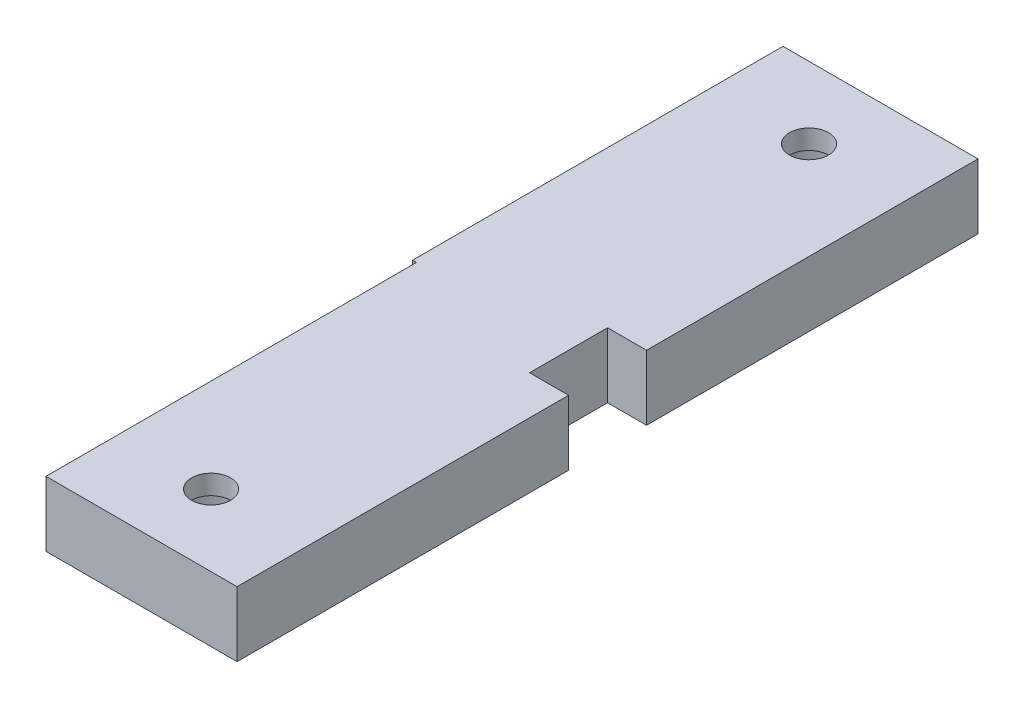
ISO-10303-21;
HEADER;
FILE_DESCRIPTION(('STEP AP214'),'2;1');
FILE_NAME('part.step','',(''),(''),'','','');
FILE_SCHEMA(('AUTOMOTIVE_DESIGN { 1 0 10303 214 1 1 1 1 }'));
ENDSEC;
DATA;
#1=APPLICATION_CONTEXT('core data for automotive mechanical design processes');
#2=APPLICATION_PROTOCOL_DEFINITION('international standard','automotive_design',2000,#1);
#3=PRODUCT_CONTEXT('',#1,'mechanical');
#4=PRODUCT('Part','Part','',(#3));
#5=PRODUCT_RELATED_PRODUCT_CATEGORY('part','',(#4));
#6=PRODUCT_DEFINITION_FORMATION('','',#4);
#7=PRODUCT_DEFINITION_CONTEXT('part definition',#1,'design');
#8=PRODUCT_DEFINITION('design','',#6,#7);
#9=PRODUCT_DEFINITION_SHAPE('','',#8);
#10=(LENGTH_UNIT() NAMED_UNIT(*) SI_UNIT(.MILLI.,.METRE.));
#11=(NAMED_UNIT(*) PLANE_ANGLE_UNIT() SI_UNIT($,.RADIAN.));
#12=(NAMED_UNIT(*) SI_UNIT($,.STERADIAN.) SOLID_ANGLE_UNIT());
#13=UNCERTAINTY_MEASURE_WITH_UNIT(LENGTH_MEASURE(1.E-05),#10,'distance_accuracy_value','');
#14=(GEOMETRIC_REPRESENTATION_CONTEXT(3) GLOBAL_UNCERTAINTY_ASSIGNED_CONTEXT((#13)) GLOBAL_UNIT_ASSIGNED_CONTEXT((#10,
#11,#12)) REPRESENTATION_CONTEXT('',''));
#15=CARTESIAN_POINT('',(0.,0.,0.));
#16=DIRECTION('',(0.,0.,1.));
#17=DIRECTION('',(1.,0.,0.));
#18=AXIS2_PLACEMENT_3D('',#15,#16,#17);
#19=CARTESIAN_POINT('',(-22.4306549314346,5.,42.4705817510549));
#20=DIRECTION('',(0.,0.,-1.));
#21=DIRECTION('',(-1.,0.,0.));
#22=AXIS2_PLACEMENT_3D('',#19,#20,#21);
#23=PLANE('',#22);
#24=DIRECTION('',(0.,-1.,0.));
#25=VECTOR('',#24,1.);
#26=CARTESIAN_POINT('',(-19.1306549314346,5.,42.4705817510549));
#27=LINE('',#26,#25);
#28=CARTESIAN_POINT('',(-19.1306549314346,5.,42.4705817510549));
#29=VERTEX_POINT('',#28);
#30=CARTESIAN_POINT('',(-19.1306549314346,0.,42.4705817510549));
#31=VERTEX_POINT('',#30);
#32=EDGE_CURVE('E122',#29,#31,#27,.T.);
#33=ORIENTED_EDGE('',*,*,#32,.T.);
#34=DIRECTION('',(1.,0.,0.));
#35=VECTOR('',#34,1.);
#36=CARTESIAN_POINT('',(-22.4306549314346,0.,42.4705817510549));
#37=LINE('',#36,#35);
#38=CARTESIAN_POINT('',(-4.4306549314346,0.,42.4705817510549));
#39=VERTEX_POINT('',#38);
#40=EDGE_CURVE('E238',#31,#39,#37,.T.);
#41=ORIENTED_EDGE('',*,*,#40,.T.);
#42=DIRECTION('',(0.,1.,0.));
#43=VECTOR('',#42,1.);
#44=CARTESIAN_POINT('',(-4.43065493143459,0.,42.4705817510548));
#45=LINE('',#44,#43);
#46=CARTESIAN_POINT('',(-4.43065493143459,5.,42.4705817510548));
#47=VERTEX_POINT('',#46);
#48=EDGE_CURVE('E200',#39,#47,#45,.T.);
#49=ORIENTED_EDGE('',*,*,#48,.T.);
#50=DIRECTION('',(1.,0.,0.));
#51=VECTOR('',#50,1.);
#52=CARTESIAN_POINT('',(-22.4306549314346,5.,42.4705817510549));
#53=LINE('',#52,#51);
#54=EDGE_CURVE('E11',#29,#47,#53,.T.);
#55=ORIENTED_EDGE('',*,*,#54,.F.);
#56=EDGE_LOOP('',(#33,#41,#49,#55));
#57=FACE_BOUND('',#56,.T.);
#58=ADVANCED_FACE('F38',(#57),#23,.F.);
#59=CARTESIAN_POINT('',(0.,5.,0.));
#60=DIRECTION('',(0.,-1.,0.));
#61=DIRECTION('',(0.,0.,-1.));
#62=AXIS2_PLACEMENT_3D('',#59,#60,#61);
#63=PLANE('',#62);
#64=CARTESIAN_POINT('',(-11.9306549314346,5.,36.9705817510549));
#65=DIRECTION('',(0.,1.,0.));
#66=DIRECTION('',(0.,0.,1.));
#67=AXIS2_PLACEMENT_3D('',#64,#65,#66);
#68=CIRCLE('',#67,1.5);
#69=CARTESIAN_POINT('',(-11.9306549314346,5.,38.4705817510549));
#70=VERTEX_POINT('',#69);
#71=EDGE_CURVE('E231',#70,#70,#68,.T.);
#72=ORIENTED_EDGE('',*,*,#71,.F.);
#73=EDGE_LOOP('',(#72));
#74=FACE_BOUND('',#73,.T.);
#75=CARTESIAN_POINT('',(-11.9306549314346,5.,-9.02941824894515));
#76=DIRECTION('',(0.,1.,0.));
#77=DIRECTION('',(0.,0.,1.));
#78=AXIS2_PLACEMENT_3D('',#75,#76,#77);
#79=CIRCLE('',#78,1.5);
#80=CARTESIAN_POINT('',(-11.9306549314346,5.,-7.52941824894515));
#81=VERTEX_POINT('',#80);
#82=EDGE_CURVE('E227',#81,#81,#79,.T.);
#83=ORIENTED_EDGE('',*,*,#82,.F.);
#84=EDGE_LOOP('',(#83));
#85=FACE_BOUND('',#84,.T.);
#86=DIRECTION('',(0.,0.,-1.));
#87=VECTOR('',#86,1.);
#88=CARTESIAN_POINT('',(-19.1306549314346,5.,0.));
#89=LINE('',#88,#87);
#90=CARTESIAN_POINT('',(-19.1306549314346,5.,13.9705817510549));
#91=VERTEX_POINT('',#90);
#92=EDGE_CURVE('E117',#29,#91,#89,.T.);
#93=ORIENTED_EDGE('',*,*,#92,.F.);
#94=ORIENTED_EDGE('',*,*,#54,.T.);
#95=DIRECTION('',(0.,0.,1.));
#96=VECTOR('',#95,1.);
#97=CARTESIAN_POINT('',(-4.43065493143459,5.,-14.5294182489452));
#98=LINE('',#97,#96);
#99=CARTESIAN_POINT('',(-4.43065493143459,5.,16.9705817510548));
#100=VERTEX_POINT('',#99);
#101=EDGE_CURVE('E175',#100,#47,#98,.T.);
#102=ORIENTED_EDGE('',*,*,#101,.F.);
#103=DIRECTION('',(1.,0.,0.));
#104=VECTOR('',#103,1.);
#105=CARTESIAN_POINT('',(-7.4306549314346,5.,16.9705817510548));
#106=LINE('',#105,#104);
#107=CARTESIAN_POINT('',(-7.4306549314346,5.,16.9705817510548));
#108=VERTEX_POINT('',#107);
#109=EDGE_CURVE('E147',#108,#100,#106,.T.);
#110=ORIENTED_EDGE('',*,*,#109,.F.);
#111=DIRECTION('',(0.,0.,1.));
#112=VECTOR('',#111,1.);
#113=CARTESIAN_POINT('',(-7.4306549314346,5.,10.9705817510548));
#114=LINE('',#113,#112);
#115=CARTESIAN_POINT('',(-7.4306549314346,5.,10.9705817510548));
#116=VERTEX_POINT('',#115);
#117=EDGE_CURVE('E155',#116,#108,#114,.T.);
#118=ORIENTED_EDGE('',*,*,#117,.F.);
#119=DIRECTION('',(-1.,0.,0.));
#120=VECTOR('',#119,1.);
#121=CARTESIAN_POINT('',(-4.4306549314346,5.,10.9705817510548));
#122=LINE('',#121,#120);
#123=CARTESIAN_POINT('',(-4.4306549314346,5.,10.9705817510548));
#124=VERTEX_POINT('',#123);
#125=EDGE_CURVE('E165',#124,#116,#122,.T.);
#126=ORIENTED_EDGE('',*,*,#125,.F.);
#127=CARTESIAN_POINT('',(-4.43065493143459,5.,-14.5294182489452));
#128=VERTEX_POINT('',#127);
#129=EDGE_CURVE('E202',#128,#124,#98,.T.);
#130=ORIENTED_EDGE('',*,*,#129,.F.);
#131=DIRECTION('',(1.,0.,0.));
#132=VECTOR('',#131,1.);
#133=CARTESIAN_POINT('',(-22.4306549314346,5.,-14.5294182489452));
#134=LINE('',#133,#132);
#135=CARTESIAN_POINT('',(-19.4306549314346,5.,-14.5294182489452));
#136=VERTEX_POINT('',#135);
#137=EDGE_CURVE('E48',#136,#128,#134,.T.);
#138=ORIENTED_EDGE('',*,*,#137,.F.);
#139=DIRECTION('',(0.,0.,-1.));
#140=VECTOR('',#139,1.);
#141=CARTESIAN_POINT('',(-19.4306549314346,5.,-14.5294182489452));
#142=LINE('',#141,#140);
#143=CARTESIAN_POINT('',(-19.4306549314346,5.,13.9705817510549));
#144=VERTEX_POINT('',#143);
#145=EDGE_CURVE('E137',#144,#136,#142,.T.);
#146=ORIENTED_EDGE('',*,*,#145,.F.);
#147=DIRECTION('',(1.,0.,0.));
#148=VECTOR('',#147,1.);
#149=CARTESIAN_POINT('',(0.,5.,13.9705817510548));
#150=LINE('',#149,#148);
#151=EDGE_CURVE('E56',#144,#91,#150,.T.);
#152=ORIENTED_EDGE('',*,*,#151,.T.);
#153=EDGE_LOOP('',(#93,#94,#102,#110,#118,#126,#130,#138,#146,#152));
#154=FACE_BOUND('',#153,.T.);
#155=ADVANCED_FACE('F135',(#74,#85,#154),#63,.F.);
#156=CARTESIAN_POINT('',(0.,0.,0.));
#157=DIRECTION('',(0.,-1.,0.));
#158=DIRECTION('',(0.,0.,-1.));
#159=AXIS2_PLACEMENT_3D('',#156,#157,#158);
#160=PLANE('',#159);
#161=CARTESIAN_POINT('',(-11.9306549314346,0.,36.9705817510549));
#162=DIRECTION('',(0.,-1.,0.));
#163=DIRECTION('',(0.,0.,-1.));
#164=AXIS2_PLACEMENT_3D('',#161,#162,#163);
#165=CIRCLE('',#164,3.5);
#166=CARTESIAN_POINT('',(-11.9306549314346,0.,33.4705817510549));
#167=VERTEX_POINT('',#166);
#168=EDGE_CURVE('E195',#167,#167,#165,.T.);
#169=ORIENTED_EDGE('',*,*,#168,.F.);
#170=EDGE_LOOP('',(#169));
#171=FACE_BOUND('',#170,.T.);
#172=CARTESIAN_POINT('',(-11.9306549314346,0.,-9.02941824894515));
#173=DIRECTION('',(0.,-1.,0.));
#174=DIRECTION('',(0.,0.,-1.));
#175=AXIS2_PLACEMENT_3D('',#172,#173,#174);
#176=CIRCLE('',#175,3.5);
#177=CARTESIAN_POINT('',(-11.9306549314346,0.,-12.5294182489452));
#178=VERTEX_POINT('',#177);
#179=EDGE_CURVE('E223',#178,#178,#176,.T.);
#180=ORIENTED_EDGE('',*,*,#179,.F.);
#181=EDGE_LOOP('',(#180));
#182=FACE_BOUND('',#181,.T.);
#183=ORIENTED_EDGE('',*,*,#40,.F.);
#184=DIRECTION('',(0.,0.,-1.));
#185=VECTOR('',#184,1.);
#186=CARTESIAN_POINT('',(-19.1306549314346,0.,0.));
#187=LINE('',#186,#185);
#188=CARTESIAN_POINT('',(-19.1306549314346,0.,13.9705817510549));
#189=VERTEX_POINT('',#188);
#190=EDGE_CURVE('E139',#31,#189,#187,.T.);
#191=ORIENTED_EDGE('',*,*,#190,.T.);
#192=DIRECTION('',(1.,0.,0.));
#193=VECTOR('',#192,1.);
#194=CARTESIAN_POINT('',(0.,0.,13.9705817510548));
#195=LINE('',#194,#193);
#196=CARTESIAN_POINT('',(-19.4306549314346,0.,13.9705817510549));
#197=VERTEX_POINT('',#196);
#198=EDGE_CURVE('E130',#197,#189,#195,.T.);
#199=ORIENTED_EDGE('',*,*,#198,.F.);
#200=DIRECTION('',(0.,0.,-1.));
#201=VECTOR('',#200,1.);
#202=CARTESIAN_POINT('',(-19.4306549314346,0.,-14.5294182489452));
#203=LINE('',#202,#201);
#204=CARTESIAN_POINT('',(-19.4306549314346,0.,-14.5294182489452));
#205=VERTEX_POINT('',#204);
#206=EDGE_CURVE('E185',#197,#205,#203,.T.);
#207=ORIENTED_EDGE('',*,*,#206,.T.);
#208=DIRECTION('',(1.,0.,0.));
#209=VECTOR('',#208,1.);
#210=CARTESIAN_POINT('',(-22.4306549314346,0.,-14.5294182489452));
#211=LINE('',#210,#209);
#212=CARTESIAN_POINT('',(-4.43065493143459,0.,-14.5294182489452));
#213=VERTEX_POINT('',#212);
#214=EDGE_CURVE('E235',#205,#213,#211,.T.);
#215=ORIENTED_EDGE('',*,*,#214,.T.);
#216=DIRECTION('',(0.,0.,1.));
#217=VECTOR('',#216,1.);
#218=CARTESIAN_POINT('',(-4.43065493143459,0.,-14.5294182489452));
#219=LINE('',#218,#217);
#220=CARTESIAN_POINT('',(-4.43065493143459,0.,10.9705817510548));
#221=VERTEX_POINT('',#220);
#222=EDGE_CURVE('E196',#213,#221,#219,.T.);
#223=ORIENTED_EDGE('',*,*,#222,.T.);
#224=DIRECTION('',(-1.,0.,0.));
#225=VECTOR('',#224,1.);
#226=CARTESIAN_POINT('',(-4.4306549314346,0.,10.9705817510548));
#227=LINE('',#226,#225);
#228=CARTESIAN_POINT('',(-7.4306549314346,0.,10.9705817510548));
#229=VERTEX_POINT('',#228);
#230=EDGE_CURVE('E64',#221,#229,#227,.T.);
#231=ORIENTED_EDGE('',*,*,#230,.T.);
#232=DIRECTION('',(0.,0.,1.));
#233=VECTOR('',#232,1.);
#234=CARTESIAN_POINT('',(-7.4306549314346,0.,10.9705817510548));
#235=LINE('',#234,#233);
#236=CARTESIAN_POINT('',(-7.4306549314346,0.,16.9705817510548));
#237=VERTEX_POINT('',#236);
#238=EDGE_CURVE('E158',#229,#237,#235,.T.);
#239=ORIENTED_EDGE('',*,*,#238,.T.);
#240=DIRECTION('',(1.,0.,0.));
#241=VECTOR('',#240,1.);
#242=CARTESIAN_POINT('',(-7.4306549314346,0.,16.9705817510548));
#243=LINE('',#242,#241);
#244=CARTESIAN_POINT('',(-4.43065493143459,0.,16.9705817510548));
#245=VERTEX_POINT('',#244);
#246=EDGE_CURVE('E151',#237,#245,#243,.T.);
#247=ORIENTED_EDGE('',*,*,#246,.T.);
#248=EDGE_CURVE('E201',#245,#39,#219,.T.);
#249=ORIENTED_EDGE('',*,*,#248,.T.);
#250=EDGE_LOOP('',(#183,#191,#199,#207,#215,#223,#231,#239,#247,#249));
#251=FACE_BOUND('',#250,.T.);
#252=ADVANCED_FACE('F270',(#171,#182,#251),#160,.T.);
#253=CARTESIAN_POINT('',(-4.43065493143459,0.,-14.5294182489452));
#254=DIRECTION('',(-1.,0.,0.));
#255=DIRECTION('',(0.,0.,1.));
#256=AXIS2_PLACEMENT_3D('',#253,#254,#255);
#257=PLANE('',#256);
#258=ORIENTED_EDGE('',*,*,#248,.F.);
#259=DIRECTION('',(0.,1.,0.));
#260=VECTOR('',#259,1.);
#261=CARTESIAN_POINT('',(-4.43065493143459,0.,16.9705817510548));
#262=LINE('',#261,#260);
#263=EDGE_CURVE('E162',#245,#100,#262,.T.);
#264=ORIENTED_EDGE('',*,*,#263,.T.);
#265=ORIENTED_EDGE('',*,*,#101,.T.);
#266=ORIENTED_EDGE('',*,*,#48,.F.);
#267=EDGE_LOOP('',(#258,#264,#265,#266));
#268=FACE_BOUND('',#267,.T.);
#269=ADVANCED_FACE('F260',(#268),#257,.F.);
#270=CARTESIAN_POINT('',(-11.9306549314346,0.,36.9705817510549));
#271=DIRECTION('',(0.,1.,0.));
#272=DIRECTION('',(0.,0.,1.));
#273=AXIS2_PLACEMENT_3D('',#270,#271,#272);
#274=CYLINDRICAL_SURFACE('',#273,1.5);
#275=ORIENTED_EDGE('',*,*,#71,.T.);
#276=EDGE_LOOP('',(#275));
#277=FACE_BOUND('',#276,.T.);
#278=CARTESIAN_POINT('',(-11.9306549314346,3.5,36.9705817510549));
#279=DIRECTION('',(0.,-1.,0.));
#280=DIRECTION('',(0.,0.,-1.));
#281=AXIS2_PLACEMENT_3D('',#278,#279,#280);
#282=CIRCLE('',#281,1.5);
#283=CARTESIAN_POINT('',(-11.9306549314346,3.5,35.4705817510549));
#284=VERTEX_POINT('',#283);
#285=EDGE_CURVE('E42',#284,#284,#282,.F.);
#286=ORIENTED_EDGE('',*,*,#285,.F.);
#287=EDGE_LOOP('',(#286));
#288=FACE_BOUND('',#287,.T.);
#289=ADVANCED_FACE('F252',(#277,#288),#274,.F.);
#290=CARTESIAN_POINT('',(-11.9306549314346,0.,-9.02941824894515));
#291=DIRECTION('',(0.,1.,0.));
#292=DIRECTION('',(0.,0.,1.));
#293=AXIS2_PLACEMENT_3D('',#290,#291,#292);
#294=CYLINDRICAL_SURFACE('',#293,1.5);
#295=ORIENTED_EDGE('',*,*,#82,.T.);
#296=EDGE_LOOP('',(#295));
#297=FACE_BOUND('',#296,.T.);
#298=CARTESIAN_POINT('',(-11.9306549314346,3.5,-9.02941824894515));
#299=DIRECTION('',(0.,-1.,0.));
#300=DIRECTION('',(0.,0.,-1.));
#301=AXIS2_PLACEMENT_3D('',#298,#299,#300);
#302=CIRCLE('',#301,1.5);
#303=CARTESIAN_POINT('',(-11.9306549314346,3.5,-10.5294182489452));
#304=VERTEX_POINT('',#303);
#305=EDGE_CURVE('E222',#304,#304,#302,.F.);
#306=ORIENTED_EDGE('',*,*,#305,.F.);
#307=EDGE_LOOP('',(#306));
#308=FACE_BOUND('',#307,.T.);
#309=ADVANCED_FACE('F250',(#297,#308),#294,.F.);
#310=CARTESIAN_POINT('',(-22.4306549314346,5.,-14.5294182489452));
#311=DIRECTION('',(0.,0.,-1.));
#312=DIRECTION('',(-1.,0.,0.));
#313=AXIS2_PLACEMENT_3D('',#310,#311,#312);
#314=PLANE('',#313);
#315=DIRECTION('',(0.,1.,0.));
#316=VECTOR('',#315,1.);
#317=CARTESIAN_POINT('',(-19.4306549314346,0.,-14.5294182489452));
#318=LINE('',#317,#316);
#319=EDGE_CURVE('E188',#205,#136,#318,.T.);
#320=ORIENTED_EDGE('',*,*,#319,.T.);
#321=ORIENTED_EDGE('',*,*,#137,.T.);
#322=DIRECTION('',(0.,1.,0.));
#323=VECTOR('',#322,1.);
#324=CARTESIAN_POINT('',(-4.43065493143459,0.,-14.5294182489452));
#325=LINE('',#324,#323);
#326=EDGE_CURVE('E191',#213,#128,#325,.T.);
#327=ORIENTED_EDGE('',*,*,#326,.F.);
#328=ORIENTED_EDGE('',*,*,#214,.F.);
#329=EDGE_LOOP('',(#320,#321,#327,#328));
#330=FACE_BOUND('',#329,.T.);
#331=ADVANCED_FACE('F40',(#330),#314,.T.);
#332=CARTESIAN_POINT('',(-11.9306549314346,3.5,-9.02941824894515));
#333=DIRECTION('',(0.,-1.,0.));
#334=DIRECTION('',(0.,0.,-1.));
#335=AXIS2_PLACEMENT_3D('',#332,#333,#334);
#336=PLANE('',#335);
#337=CARTESIAN_POINT('',(-11.9306549314346,3.5,-9.02941824894515));
#338=DIRECTION('',(0.,-1.,0.));
#339=DIRECTION('',(0.,0.,-1.));
#340=AXIS2_PLACEMENT_3D('',#337,#338,#339);
#341=CIRCLE('',#340,3.5);
#342=CARTESIAN_POINT('',(-11.9306549314346,3.5,-12.5294182489452));
#343=VERTEX_POINT('',#342);
#344=EDGE_CURVE('E218',#343,#343,#341,.T.);
#345=ORIENTED_EDGE('',*,*,#344,.T.);
#346=EDGE_LOOP('',(#345));
#347=FACE_BOUND('',#346,.T.);
#348=ORIENTED_EDGE('',*,*,#305,.T.);
#349=EDGE_LOOP('',(#348));
#350=FACE_BOUND('',#349,.T.);
#351=ADVANCED_FACE('F248',(#347,#350),#336,.T.);
#352=CARTESIAN_POINT('',(-11.9306549314346,3.5,-9.02941824894515));
#353=DIRECTION('',(0.,-1.,0.));
#354=DIRECTION('',(0.,0.,-1.));
#355=AXIS2_PLACEMENT_3D('',#352,#353,#354);
#356=CYLINDRICAL_SURFACE('',#355,3.5);
#357=ORIENTED_EDGE('',*,*,#344,.F.);
#358=EDGE_LOOP('',(#357));
#359=FACE_BOUND('',#358,.T.);
#360=ORIENTED_EDGE('',*,*,#179,.T.);
#361=EDGE_LOOP('',(#360));
#362=FACE_BOUND('',#361,.T.);
#363=ADVANCED_FACE('F304',(#359,#362),#356,.F.);
#364=CARTESIAN_POINT('',(-11.9306549314346,3.5,36.9705817510549));
#365=DIRECTION('',(0.,-1.,0.));
#366=DIRECTION('',(0.,0.,-1.));
#367=AXIS2_PLACEMENT_3D('',#364,#365,#366);
#368=PLANE('',#367);
#369=CARTESIAN_POINT('',(-11.9306549314346,3.5,36.9705817510549));
#370=DIRECTION('',(0.,-1.,0.));
#371=DIRECTION('',(0.,0.,-1.));
#372=AXIS2_PLACEMENT_3D('',#369,#370,#371);
#373=CIRCLE('',#372,3.5);
#374=CARTESIAN_POINT('',(-11.9306549314346,3.5,33.4705817510549));
#375=VERTEX_POINT('',#374);
#376=EDGE_CURVE('E211',#375,#375,#373,.T.);
#377=ORIENTED_EDGE('',*,*,#376,.T.);
#378=EDGE_LOOP('',(#377));
#379=FACE_BOUND('',#378,.T.);
#380=ORIENTED_EDGE('',*,*,#285,.T.);
#381=EDGE_LOOP('',(#380));
#382=FACE_BOUND('',#381,.T.);
#383=ADVANCED_FACE('F300',(#379,#382),#368,.T.);
#384=CARTESIAN_POINT('',(-11.9306549314346,3.5,36.9705817510549));
#385=DIRECTION('',(0.,-1.,0.));
#386=DIRECTION('',(0.,0.,-1.));
#387=AXIS2_PLACEMENT_3D('',#384,#385,#386);
#388=CYLINDRICAL_SURFACE('',#387,3.5);
#389=ORIENTED_EDGE('',*,*,#376,.F.);
#390=EDGE_LOOP('',(#389));
#391=FACE_BOUND('',#390,.T.);
#392=ORIENTED_EDGE('',*,*,#168,.T.);
#393=EDGE_LOOP('',(#392));
#394=FACE_BOUND('',#393,.T.);
#395=ADVANCED_FACE('F303',(#391,#394),#388,.F.);
#396=ORIENTED_EDGE('',*,*,#129,.T.);
#397=DIRECTION('',(0.,1.,0.));
#398=VECTOR('',#397,1.);
#399=CARTESIAN_POINT('',(-4.4306549314346,0.,10.9705817510548));
#400=LINE('',#399,#398);
#401=EDGE_CURVE('E179',#221,#124,#400,.T.);
#402=ORIENTED_EDGE('',*,*,#401,.F.);
#403=ORIENTED_EDGE('',*,*,#222,.F.);
#404=ORIENTED_EDGE('',*,*,#326,.T.);
#405=EDGE_LOOP('',(#396,#402,#403,#404));
#406=FACE_BOUND('',#405,.T.);
#407=ADVANCED_FACE('F282',(#406),#257,.F.);
#408=CARTESIAN_POINT('',(-19.4306549314346,0.,-14.5294182489452));
#409=DIRECTION('',(1.,0.,0.));
#410=DIRECTION('',(0.,0.,-1.));
#411=AXIS2_PLACEMENT_3D('',#408,#409,#410);
#412=PLANE('',#411);
#413=ORIENTED_EDGE('',*,*,#206,.F.);
#414=DIRECTION('',(0.,-1.,0.));
#415=VECTOR('',#414,1.);
#416=CARTESIAN_POINT('',(-19.4306549314346,5.,13.9705817510549));
#417=LINE('',#416,#415);
#418=EDGE_CURVE('E126',#144,#197,#417,.T.);
#419=ORIENTED_EDGE('',*,*,#418,.F.);
#420=ORIENTED_EDGE('',*,*,#145,.T.);
#421=ORIENTED_EDGE('',*,*,#319,.F.);
#422=EDGE_LOOP('',(#413,#419,#420,#421));
#423=FACE_BOUND('',#422,.T.);
#424=ADVANCED_FACE('F365',(#423),#412,.F.);
#425=CARTESIAN_POINT('',(-7.4306549314346,0.,16.9705817510548));
#426=DIRECTION('',(0.,0.,1.));
#427=DIRECTION('',(1.,0.,0.));
#428=AXIS2_PLACEMENT_3D('',#425,#426,#427);
#429=PLANE('',#428);
#430=ORIENTED_EDGE('',*,*,#109,.T.);
#431=ORIENTED_EDGE('',*,*,#263,.F.);
#432=ORIENTED_EDGE('',*,*,#246,.F.);
#433=DIRECTION('',(0.,1.,0.));
#434=VECTOR('',#433,1.);
#435=CARTESIAN_POINT('',(-7.4306549314346,0.,16.9705817510548));
#436=LINE('',#435,#434);
#437=EDGE_CURVE('E172',#237,#108,#436,.T.);
#438=ORIENTED_EDGE('',*,*,#437,.T.);
#439=EDGE_LOOP('',(#430,#431,#432,#438));
#440=FACE_BOUND('',#439,.T.);
#441=ADVANCED_FACE('F369',(#440),#429,.F.);
#442=CARTESIAN_POINT('',(-7.4306549314346,0.,10.9705817510548));
#443=DIRECTION('',(-1.,0.,0.));
#444=DIRECTION('',(0.,0.,1.));
#445=AXIS2_PLACEMENT_3D('',#442,#443,#444);
#446=PLANE('',#445);
#447=ORIENTED_EDGE('',*,*,#117,.T.);
#448=ORIENTED_EDGE('',*,*,#437,.F.);
#449=ORIENTED_EDGE('',*,*,#238,.F.);
#450=DIRECTION('',(0.,1.,0.));
#451=VECTOR('',#450,1.);
#452=CARTESIAN_POINT('',(-7.4306549314346,0.,10.9705817510548));
#453=LINE('',#452,#451);
#454=EDGE_CURVE('E176',#229,#116,#453,.T.);
#455=ORIENTED_EDGE('',*,*,#454,.T.);
#456=EDGE_LOOP('',(#447,#448,#449,#455));
#457=FACE_BOUND('',#456,.T.);
#458=ADVANCED_FACE('F373',(#457),#446,.F.);
#459=CARTESIAN_POINT('',(-4.4306549314346,0.,10.9705817510548));
#460=DIRECTION('',(0.,0.,-1.));
#461=DIRECTION('',(-1.,0.,0.));
#462=AXIS2_PLACEMENT_3D('',#459,#460,#461);
#463=PLANE('',#462);
#464=ORIENTED_EDGE('',*,*,#125,.T.);
#465=ORIENTED_EDGE('',*,*,#454,.F.);
#466=ORIENTED_EDGE('',*,*,#230,.F.);
#467=ORIENTED_EDGE('',*,*,#401,.T.);
#468=EDGE_LOOP('',(#464,#465,#466,#467));
#469=FACE_BOUND('',#468,.T.);
#470=ADVANCED_FACE('F383',(#469),#463,.F.);
#471=CARTESIAN_POINT('',(-19.1306549314346,5.,0.));
#472=DIRECTION('',(-1.,0.,0.));
#473=DIRECTION('',(0.,0.,1.));
#474=AXIS2_PLACEMENT_3D('',#471,#472,#473);
#475=PLANE('',#474);
#476=ORIENTED_EDGE('',*,*,#190,.F.);
#477=ORIENTED_EDGE('',*,*,#32,.F.);
#478=ORIENTED_EDGE('',*,*,#92,.T.);
#479=DIRECTION('',(0.,-1.,0.));
#480=VECTOR('',#479,1.);
#481=CARTESIAN_POINT('',(-19.1306549314346,5.,13.9705817510549));
#482=LINE('',#481,#480);
#483=EDGE_CURVE('E119',#91,#189,#482,.T.);
#484=ORIENTED_EDGE('',*,*,#483,.T.);
#485=EDGE_LOOP('',(#476,#477,#478,#484));
#486=FACE_BOUND('',#485,.T.);
#487=ADVANCED_FACE('F118',(#486),#475,.T.);
#488=CARTESIAN_POINT('',(0.,5.,13.9705817510548));
#489=DIRECTION('',(0.,0.,-1.));
#490=DIRECTION('',(-1.,0.,0.));
#491=AXIS2_PLACEMENT_3D('',#488,#489,#490);
#492=PLANE('',#491);
#493=ORIENTED_EDGE('',*,*,#198,.T.);
#494=ORIENTED_EDGE('',*,*,#483,.F.);
#495=ORIENTED_EDGE('',*,*,#151,.F.);
#496=ORIENTED_EDGE('',*,*,#418,.T.);
#497=EDGE_LOOP('',(#493,#494,#495,#496));
#498=FACE_BOUND('',#497,.T.);
#499=ADVANCED_FACE('F128',(#498),#492,.F.);
#500=CLOSED_SHELL('',(#58,#155,#252,#269,#289,#309,#331,#351,#363,#383,#395,#407,#424,#441,#458,
#470,#487,#499));
#501=MANIFOLD_SOLID_BREP('B2',#500);
#502=ADVANCED_BREP_SHAPE_REPRESENTATION('',(#18,#501),#14);
#503=SHAPE_DEFINITION_REPRESENTATION(#9,#502);
ENDSEC;
END-ISO-10303-21;
